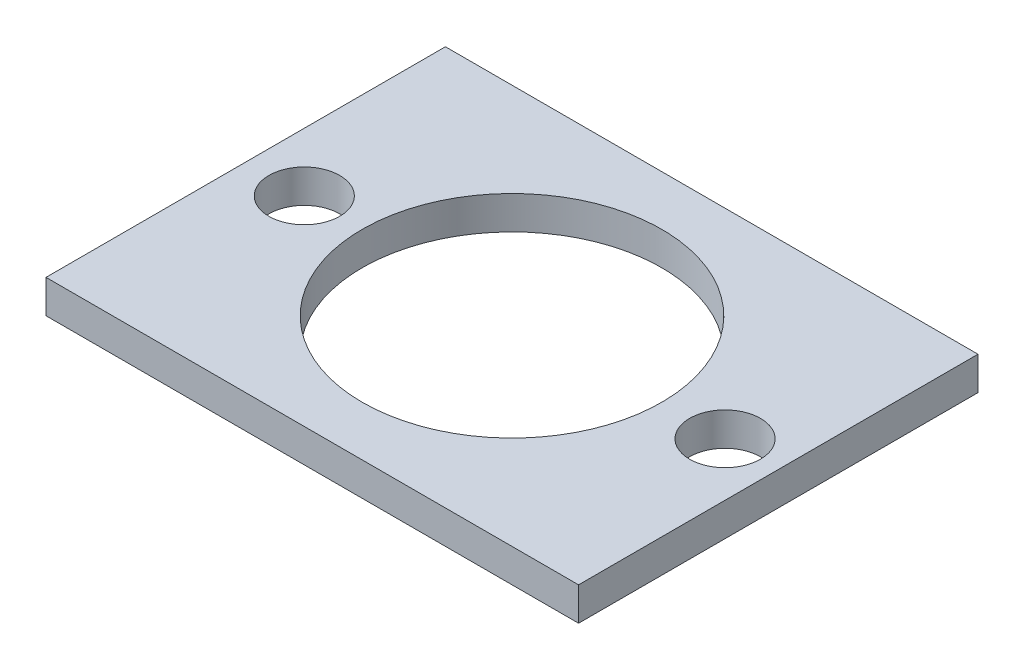
ISO-10303-21;
HEADER;
FILE_DESCRIPTION(('STEP AP214'),'2;1');
FILE_NAME('part.step','',(''),(''),'','','');
FILE_SCHEMA(('AUTOMOTIVE_DESIGN { 1 0 10303 214 1 1 1 1 }'));
ENDSEC;
DATA;
#1=APPLICATION_CONTEXT('core data for automotive mechanical design processes');
#2=APPLICATION_PROTOCOL_DEFINITION('international standard','automotive_design',2000,#1);
#3=PRODUCT_CONTEXT('',#1,'mechanical');
#4=PRODUCT('Part','Part','',(#3));
#5=PRODUCT_RELATED_PRODUCT_CATEGORY('part','',(#4));
#6=PRODUCT_DEFINITION_FORMATION('','',#4);
#7=PRODUCT_DEFINITION_CONTEXT('part definition',#1,'design');
#8=PRODUCT_DEFINITION('design','',#6,#7);
#9=PRODUCT_DEFINITION_SHAPE('','',#8);
#10=(LENGTH_UNIT() NAMED_UNIT(*) SI_UNIT(.MILLI.,.METRE.));
#11=(NAMED_UNIT(*) PLANE_ANGLE_UNIT() SI_UNIT($,.RADIAN.));
#12=(NAMED_UNIT(*) SI_UNIT($,.STERADIAN.) SOLID_ANGLE_UNIT());
#13=UNCERTAINTY_MEASURE_WITH_UNIT(LENGTH_MEASURE(1.E-05),#10,'distance_accuracy_value','');
#14=(GEOMETRIC_REPRESENTATION_CONTEXT(3) GLOBAL_UNCERTAINTY_ASSIGNED_CONTEXT((#13)) GLOBAL_UNIT_ASSIGNED_CONTEXT((#10,
#11,#12)) REPRESENTATION_CONTEXT('',''));
#15=CARTESIAN_POINT('',(0.,0.,0.));
#16=DIRECTION('',(0.,0.,1.));
#17=DIRECTION('',(1.,0.,0.));
#18=AXIS2_PLACEMENT_3D('',#15,#16,#17);
#19=CARTESIAN_POINT('',(0.,3.175,0.));
#20=DIRECTION('',(0.,1.,0.));
#21=DIRECTION('',(0.,0.,1.));
#22=AXIS2_PLACEMENT_3D('',#19,#20,#21);
#23=PLANE('',#22);
#24=CARTESIAN_POINT('',(-19.812,3.175,0.));
#25=DIRECTION('',(0.,1.,0.));
#26=DIRECTION('',(0.,0.,1.));
#27=AXIS2_PLACEMENT_3D('',#24,#25,#26);
#28=CIRCLE('',#27,3.3782);
#29=CARTESIAN_POINT('',(-19.812,3.175,3.3782));
#30=VERTEX_POINT('',#29);
#31=EDGE_CURVE('E149',#30,#30,#28,.T.);
#32=ORIENTED_EDGE('',*,*,#31,.F.);
#33=EDGE_LOOP('',(#32));
#34=FACE_BOUND('',#33,.T.);
#35=CARTESIAN_POINT('',(20.32,3.175,0.));
#36=DIRECTION('',(0.,1.,0.));
#37=DIRECTION('',(0.,0.,1.));
#38=AXIS2_PLACEMENT_3D('',#35,#36,#37);
#39=CIRCLE('',#38,3.3782);
#40=CARTESIAN_POINT('',(20.32,3.175,3.3782));
#41=VERTEX_POINT('',#40);
#42=EDGE_CURVE('E141',#41,#41,#39,.T.);
#43=ORIENTED_EDGE('',*,*,#42,.F.);
#44=EDGE_LOOP('',(#43));
#45=FACE_BOUND('',#44,.T.);
#46=DIRECTION('',(0.,0.,1.));
#47=VECTOR('',#46,1.);
#48=CARTESIAN_POINT('',(-25.4,3.175,19.05));
#49=LINE('',#48,#47);
#50=CARTESIAN_POINT('',(-25.4,3.175,-19.05));
#51=VERTEX_POINT('',#50);
#52=CARTESIAN_POINT('',(-25.4,3.175,19.05));
#53=VERTEX_POINT('',#52);
#54=EDGE_CURVE('E92',#51,#53,#49,.T.);
#55=ORIENTED_EDGE('',*,*,#54,.T.);
#56=DIRECTION('',(1.,0.,0.));
#57=VECTOR('',#56,1.);
#58=CARTESIAN_POINT('',(25.4,3.175,19.05));
#59=LINE('',#58,#57);
#60=CARTESIAN_POINT('',(25.4,3.175,19.05));
#61=VERTEX_POINT('',#60);
#62=EDGE_CURVE('E87',#53,#61,#59,.T.);
#63=ORIENTED_EDGE('',*,*,#62,.T.);
#64=DIRECTION('',(0.,0.,-1.));
#65=VECTOR('',#64,1.);
#66=CARTESIAN_POINT('',(25.4,3.175,19.05));
#67=LINE('',#66,#65);
#68=CARTESIAN_POINT('',(25.4,3.175,-19.05));
#69=VERTEX_POINT('',#68);
#70=EDGE_CURVE('E90',#61,#69,#67,.T.);
#71=ORIENTED_EDGE('',*,*,#70,.T.);
#72=DIRECTION('',(-1.,0.,0.));
#73=VECTOR('',#72,1.);
#74=CARTESIAN_POINT('',(25.4,3.175,-19.05));
#75=LINE('',#74,#73);
#76=EDGE_CURVE('E57',#69,#51,#75,.T.);
#77=ORIENTED_EDGE('',*,*,#76,.T.);
#78=EDGE_LOOP('',(#55,#63,#71,#77));
#79=FACE_BOUND('',#78,.T.);
#80=CARTESIAN_POINT('',(0.,3.175,0.));
#81=DIRECTION('',(0.,1.,0.));
#82=DIRECTION('',(0.,0.,1.));
#83=AXIS2_PLACEMENT_3D('',#80,#81,#82);
#84=CIRCLE('',#83,14.2875);
#85=CARTESIAN_POINT('',(0.,3.175,14.2875));
#86=VERTEX_POINT('',#85);
#87=EDGE_CURVE('E112',#86,#86,#84,.T.);
#88=ORIENTED_EDGE('',*,*,#87,.F.);
#89=EDGE_LOOP('',(#88));
#90=FACE_BOUND('',#89,.T.);
#91=ADVANCED_FACE('F39',(#34,#45,#79,#90),#23,.T.);
#92=CARTESIAN_POINT('',(0.,0.,0.));
#93=DIRECTION('',(0.,1.,0.));
#94=DIRECTION('',(0.,0.,1.));
#95=AXIS2_PLACEMENT_3D('',#92,#93,#94);
#96=PLANE('',#95);
#97=CARTESIAN_POINT('',(-19.812,0.,0.));
#98=DIRECTION('',(0.,1.,0.));
#99=DIRECTION('',(0.,0.,1.));
#100=AXIS2_PLACEMENT_3D('',#97,#98,#99);
#101=CIRCLE('',#100,3.3782);
#102=CARTESIAN_POINT('',(-19.812,0.,3.3782));
#103=VERTEX_POINT('',#102);
#104=EDGE_CURVE('E145',#103,#103,#101,.T.);
#105=ORIENTED_EDGE('',*,*,#104,.T.);
#106=EDGE_LOOP('',(#105));
#107=FACE_BOUND('',#106,.T.);
#108=CARTESIAN_POINT('',(20.32,0.,0.));
#109=DIRECTION('',(0.,1.,0.));
#110=DIRECTION('',(0.,0.,1.));
#111=AXIS2_PLACEMENT_3D('',#108,#109,#110);
#112=CIRCLE('',#111,3.3782);
#113=CARTESIAN_POINT('',(20.32,0.,3.3782));
#114=VERTEX_POINT('',#113);
#115=EDGE_CURVE('E134',#114,#114,#112,.T.);
#116=ORIENTED_EDGE('',*,*,#115,.T.);
#117=EDGE_LOOP('',(#116));
#118=FACE_BOUND('',#117,.T.);
#119=DIRECTION('',(0.,0.,1.));
#120=VECTOR('',#119,1.);
#121=CARTESIAN_POINT('',(-25.4,0.,19.05));
#122=LINE('',#121,#120);
#123=CARTESIAN_POINT('',(-25.4,0.,-19.05));
#124=VERTEX_POINT('',#123);
#125=CARTESIAN_POINT('',(-25.4,0.,19.05));
#126=VERTEX_POINT('',#125);
#127=EDGE_CURVE('E108',#124,#126,#122,.T.);
#128=ORIENTED_EDGE('',*,*,#127,.F.);
#129=DIRECTION('',(-1.,0.,0.));
#130=VECTOR('',#129,1.);
#131=CARTESIAN_POINT('',(25.4,0.,-19.05));
#132=LINE('',#131,#130);
#133=CARTESIAN_POINT('',(25.4,0.,-19.05));
#134=VERTEX_POINT('',#133);
#135=EDGE_CURVE('E80',#134,#124,#132,.T.);
#136=ORIENTED_EDGE('',*,*,#135,.F.);
#137=DIRECTION('',(0.,0.,-1.));
#138=VECTOR('',#137,1.);
#139=CARTESIAN_POINT('',(25.4,0.,19.05));
#140=LINE('',#139,#138);
#141=CARTESIAN_POINT('',(25.4,0.,19.05));
#142=VERTEX_POINT('',#141);
#143=EDGE_CURVE('E74',#142,#134,#140,.T.);
#144=ORIENTED_EDGE('',*,*,#143,.F.);
#145=DIRECTION('',(1.,0.,0.));
#146=VECTOR('',#145,1.);
#147=CARTESIAN_POINT('',(25.4,0.,19.05));
#148=LINE('',#147,#146);
#149=EDGE_CURVE('E97',#126,#142,#148,.T.);
#150=ORIENTED_EDGE('',*,*,#149,.F.);
#151=EDGE_LOOP('',(#128,#136,#144,#150));
#152=FACE_BOUND('',#151,.T.);
#153=CARTESIAN_POINT('',(0.,0.,0.));
#154=DIRECTION('',(0.,1.,0.));
#155=DIRECTION('',(0.,0.,1.));
#156=AXIS2_PLACEMENT_3D('',#153,#154,#155);
#157=CIRCLE('',#156,14.2875);
#158=CARTESIAN_POINT('',(0.,0.,14.2875));
#159=VERTEX_POINT('',#158);
#160=EDGE_CURVE('E130',#159,#159,#157,.T.);
#161=ORIENTED_EDGE('',*,*,#160,.T.);
#162=EDGE_LOOP('',(#161));
#163=FACE_BOUND('',#162,.T.);
#164=ADVANCED_FACE('F125',(#107,#118,#152,#163),#96,.F.);
#165=CARTESIAN_POINT('',(-25.4,3.175,19.05));
#166=DIRECTION('',(1.,0.,0.));
#167=DIRECTION('',(0.,0.,-1.));
#168=AXIS2_PLACEMENT_3D('',#165,#166,#167);
#169=PLANE('',#168);
#170=ORIENTED_EDGE('',*,*,#127,.T.);
#171=DIRECTION('',(0.,-1.,0.));
#172=VECTOR('',#171,1.);
#173=CARTESIAN_POINT('',(-25.4,3.175,19.05));
#174=LINE('',#173,#172);
#175=EDGE_CURVE('E11',#53,#126,#174,.T.);
#176=ORIENTED_EDGE('',*,*,#175,.F.);
#177=ORIENTED_EDGE('',*,*,#54,.F.);
#178=DIRECTION('',(0.,-1.,0.));
#179=VECTOR('',#178,1.);
#180=CARTESIAN_POINT('',(-25.4,3.175,-19.05));
#181=LINE('',#180,#179);
#182=EDGE_CURVE('E104',#51,#124,#181,.T.);
#183=ORIENTED_EDGE('',*,*,#182,.T.);
#184=EDGE_LOOP('',(#170,#176,#177,#183));
#185=FACE_BOUND('',#184,.T.);
#186=ADVANCED_FACE('F41',(#185),#169,.F.);
#187=CARTESIAN_POINT('',(25.4,3.175,19.05));
#188=DIRECTION('',(0.,0.,-1.));
#189=DIRECTION('',(-1.,0.,0.));
#190=AXIS2_PLACEMENT_3D('',#187,#188,#189);
#191=PLANE('',#190);
#192=ORIENTED_EDGE('',*,*,#149,.T.);
#193=DIRECTION('',(0.,-1.,0.));
#194=VECTOR('',#193,1.);
#195=CARTESIAN_POINT('',(25.4,3.175,19.05));
#196=LINE('',#195,#194);
#197=EDGE_CURVE('E49',#61,#142,#196,.T.);
#198=ORIENTED_EDGE('',*,*,#197,.F.);
#199=ORIENTED_EDGE('',*,*,#62,.F.);
#200=ORIENTED_EDGE('',*,*,#175,.T.);
#201=EDGE_LOOP('',(#192,#198,#199,#200));
#202=FACE_BOUND('',#201,.T.);
#203=ADVANCED_FACE('F96',(#202),#191,.F.);
#204=CARTESIAN_POINT('',(25.4,3.175,19.05));
#205=DIRECTION('',(-1.,0.,0.));
#206=DIRECTION('',(0.,0.,1.));
#207=AXIS2_PLACEMENT_3D('',#204,#205,#206);
#208=PLANE('',#207);
#209=ORIENTED_EDGE('',*,*,#143,.T.);
#210=DIRECTION('',(0.,-1.,0.));
#211=VECTOR('',#210,1.);
#212=CARTESIAN_POINT('',(25.4,3.175,-19.05));
#213=LINE('',#212,#211);
#214=EDGE_CURVE('E99',#69,#134,#213,.T.);
#215=ORIENTED_EDGE('',*,*,#214,.F.);
#216=ORIENTED_EDGE('',*,*,#70,.F.);
#217=ORIENTED_EDGE('',*,*,#197,.T.);
#218=EDGE_LOOP('',(#209,#215,#216,#217));
#219=FACE_BOUND('',#218,.T.);
#220=ADVANCED_FACE('F100',(#219),#208,.F.);
#221=CARTESIAN_POINT('',(25.4,3.175,-19.05));
#222=DIRECTION('',(0.,0.,1.));
#223=DIRECTION('',(1.,0.,0.));
#224=AXIS2_PLACEMENT_3D('',#221,#222,#223);
#225=PLANE('',#224);
#226=ORIENTED_EDGE('',*,*,#135,.T.);
#227=ORIENTED_EDGE('',*,*,#182,.F.);
#228=ORIENTED_EDGE('',*,*,#76,.F.);
#229=ORIENTED_EDGE('',*,*,#214,.T.);
#230=EDGE_LOOP('',(#226,#227,#228,#229));
#231=FACE_BOUND('',#230,.T.);
#232=ADVANCED_FACE('F122',(#231),#225,.F.);
#233=CARTESIAN_POINT('',(0.,3.175,0.));
#234=DIRECTION('',(0.,-1.,0.));
#235=DIRECTION('',(0.,0.,-1.));
#236=AXIS2_PLACEMENT_3D('',#233,#234,#235);
#237=CYLINDRICAL_SURFACE('',#236,14.2875);
#238=ORIENTED_EDGE('',*,*,#87,.T.);
#239=EDGE_LOOP('',(#238));
#240=FACE_BOUND('',#239,.T.);
#241=ORIENTED_EDGE('',*,*,#160,.F.);
#242=EDGE_LOOP('',(#241));
#243=FACE_BOUND('',#242,.T.);
#244=ADVANCED_FACE('F163',(#240,#243),#237,.F.);
#245=CARTESIAN_POINT('',(20.32,3.175,0.));
#246=DIRECTION('',(0.,1.,0.));
#247=DIRECTION('',(0.,0.,1.));
#248=AXIS2_PLACEMENT_3D('',#245,#246,#247);
#249=CYLINDRICAL_SURFACE('',#248,3.3782);
#250=ORIENTED_EDGE('',*,*,#115,.F.);
#251=EDGE_LOOP('',(#250));
#252=FACE_BOUND('',#251,.T.);
#253=ORIENTED_EDGE('',*,*,#42,.T.);
#254=EDGE_LOOP('',(#253));
#255=FACE_BOUND('',#254,.T.);
#256=ADVANCED_FACE('F161',(#252,#255),#249,.F.);
#257=CARTESIAN_POINT('',(-19.812,3.175,0.));
#258=DIRECTION('',(0.,1.,0.));
#259=DIRECTION('',(0.,0.,1.));
#260=AXIS2_PLACEMENT_3D('',#257,#258,#259);
#261=CYLINDRICAL_SURFACE('',#260,3.3782);
#262=ORIENTED_EDGE('',*,*,#104,.F.);
#263=EDGE_LOOP('',(#262));
#264=FACE_BOUND('',#263,.T.);
#265=ORIENTED_EDGE('',*,*,#31,.T.);
#266=EDGE_LOOP('',(#265));
#267=FACE_BOUND('',#266,.T.);
#268=ADVANCED_FACE('F154',(#264,#267),#261,.F.);
#269=CLOSED_SHELL('',(#91,#164,#186,#203,#220,#232,#244,#256,#268));
#270=MANIFOLD_SOLID_BREP('B2',#269);
#271=ADVANCED_BREP_SHAPE_REPRESENTATION('',(#18,#270),#14);
#272=SHAPE_DEFINITION_REPRESENTATION(#9,#271);
ENDSEC;
END-ISO-10303-21;
